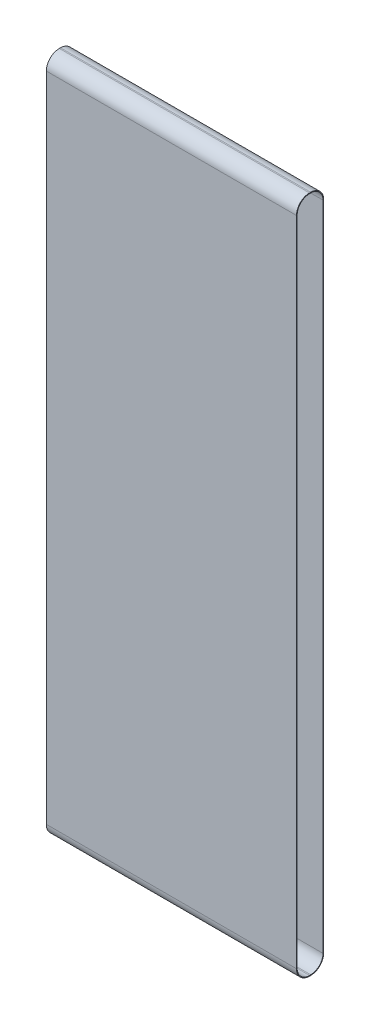
ISO-10303-21;
HEADER;
FILE_DESCRIPTION(('STEP AP214'),'2;1');
FILE_NAME('part.step','',(''),(''),'','','');
FILE_SCHEMA(('AUTOMOTIVE_DESIGN { 1 0 10303 214 1 1 1 1 }'));
ENDSEC;
DATA;
#1=APPLICATION_CONTEXT('core data for automotive mechanical design processes');
#2=APPLICATION_PROTOCOL_DEFINITION('international standard','automotive_design',2000,#1);
#3=PRODUCT_CONTEXT('',#1,'mechanical');
#4=PRODUCT('Part','Part','',(#3));
#5=PRODUCT_RELATED_PRODUCT_CATEGORY('part','',(#4));
#6=PRODUCT_DEFINITION_FORMATION('','',#4);
#7=PRODUCT_DEFINITION_CONTEXT('part definition',#1,'design');
#8=PRODUCT_DEFINITION('design','',#6,#7);
#9=PRODUCT_DEFINITION_SHAPE('','',#8);
#10=(LENGTH_UNIT() NAMED_UNIT(*) SI_UNIT(.MILLI.,.METRE.));
#11=(NAMED_UNIT(*) PLANE_ANGLE_UNIT() SI_UNIT($,.RADIAN.));
#12=(NAMED_UNIT(*) SI_UNIT($,.STERADIAN.) SOLID_ANGLE_UNIT());
#13=UNCERTAINTY_MEASURE_WITH_UNIT(LENGTH_MEASURE(1.E-05),#10,'distance_accuracy_value','');
#14=(GEOMETRIC_REPRESENTATION_CONTEXT(3) GLOBAL_UNCERTAINTY_ASSIGNED_CONTEXT((#13)) GLOBAL_UNIT_ASSIGNED_CONTEXT((#10,
#11,#12)) REPRESENTATION_CONTEXT('',''));
#15=CARTESIAN_POINT('',(0.,0.,0.));
#16=DIRECTION('',(0.,0.,1.));
#17=DIRECTION('',(1.,0.,0.));
#18=AXIS2_PLACEMENT_3D('',#15,#16,#17);
#19=CARTESIAN_POINT('',(-241.3,1308.608,26.289));
#20=DIRECTION('',(1.,0.,0.));
#21=DIRECTION('',(0.,0.,-1.));
#22=AXIS2_PLACEMENT_3D('',#19,#20,#21);
#23=PLANE('',#22);
#24=DIRECTION('',(0.,0.,-1.));
#25=VECTOR('',#24,1.);
#26=CARTESIAN_POINT('',(-241.3,1.34619999999997,1.16839999999996));
#27=LINE('',#26,#25);
#28=CARTESIAN_POINT('',(-241.3,1.34619999999995,1.16839999999997));
#29=VERTEX_POINT('',#28);
#30=CARTESIAN_POINT('',(-241.3,1.3462,-1.16840000000003));
#31=VERTEX_POINT('',#30);
#32=EDGE_CURVE('E161',#29,#31,#27,.T.);
#33=ORIENTED_EDGE('',*,*,#32,.T.);
#34=CARTESIAN_POINT('',(-241.3,25.1205999999999,-1.16840000000003));
#35=DIRECTION('',(1.,0.,0.));
#36=DIRECTION('',(0.,0.,-1.));
#37=AXIS2_PLACEMENT_3D('',#34,#35,#36);
#38=CIRCLE('',#37,23.7744);
#39=CARTESIAN_POINT('',(-241.3,25.1205999999999,-24.9428));
#40=VERTEX_POINT('',#39);
#41=EDGE_CURVE('E154',#31,#40,#38,.T.);
#42=ORIENTED_EDGE('',*,*,#41,.T.);
#43=DIRECTION('',(0.,1.,0.));
#44=VECTOR('',#43,1.);
#45=CARTESIAN_POINT('',(-241.3,25.1205999999999,-24.9428));
#46=LINE('',#45,#44);
#47=CARTESIAN_POINT('',(-241.3,1283.4874,-24.9428));
#48=VERTEX_POINT('',#47);
#49=EDGE_CURVE('E164',#40,#48,#46,.T.);
#50=ORIENTED_EDGE('',*,*,#49,.T.);
#51=CARTESIAN_POINT('',(-241.3,1283.4874,-1.16840000000003));
#52=DIRECTION('',(1.,0.,0.));
#53=DIRECTION('',(0.,0.,-1.));
#54=AXIS2_PLACEMENT_3D('',#51,#52,#53);
#55=CIRCLE('',#54,23.7744);
#56=CARTESIAN_POINT('',(-241.3,1307.2618,-1.16840000000003));
#57=VERTEX_POINT('',#56);
#58=EDGE_CURVE('E55',#48,#57,#55,.T.);
#59=ORIENTED_EDGE('',*,*,#58,.T.);
#60=DIRECTION('',(0.,0.,1.));
#61=VECTOR('',#60,1.);
#62=CARTESIAN_POINT('',(-241.3,1307.2618,-1.16840000000003));
#63=LINE('',#62,#61);
#64=CARTESIAN_POINT('',(-241.3,1307.2618,1.16839999999997));
#65=VERTEX_POINT('',#64);
#66=EDGE_CURVE('E182',#57,#65,#63,.T.);
#67=ORIENTED_EDGE('',*,*,#66,.T.);
#68=CARTESIAN_POINT('',(-241.3,1283.4874,1.16839999999997));
#69=DIRECTION('',(1.,0.,0.));
#70=DIRECTION('',(0.,0.,-1.));
#71=AXIS2_PLACEMENT_3D('',#68,#69,#70);
#72=CIRCLE('',#71,23.7744);
#73=CARTESIAN_POINT('',(-241.3,1283.4874,24.9427999999999));
#74=VERTEX_POINT('',#73);
#75=EDGE_CURVE('E186',#65,#74,#72,.T.);
#76=ORIENTED_EDGE('',*,*,#75,.T.);
#77=DIRECTION('',(0.,-1.,0.));
#78=VECTOR('',#77,1.);
#79=CARTESIAN_POINT('',(-241.3,1283.4874,24.9427999999999));
#80=LINE('',#79,#78);
#81=CARTESIAN_POINT('',(-241.3,25.1205999999999,24.9428));
#82=VERTEX_POINT('',#81);
#83=EDGE_CURVE('E190',#74,#82,#80,.T.);
#84=ORIENTED_EDGE('',*,*,#83,.T.);
#85=CARTESIAN_POINT('',(-241.3,25.1205999999999,1.16839999999997));
#86=DIRECTION('',(1.,0.,0.));
#87=DIRECTION('',(0.,0.,-1.));
#88=AXIS2_PLACEMENT_3D('',#85,#86,#87);
#89=CIRCLE('',#88,23.7744);
#90=EDGE_CURVE('E194',#82,#29,#89,.T.);
#91=ORIENTED_EDGE('',*,*,#90,.T.);
#92=EDGE_LOOP('',(#33,#42,#50,#59,#67,#76,#84,#91));
#93=FACE_BOUND('',#92,.T.);
#94=DIRECTION('',(0.,0.,1.));
#95=VECTOR('',#94,1.);
#96=CARTESIAN_POINT('',(-241.3,1308.608,26.289));
#97=LINE('',#96,#95);
#98=CARTESIAN_POINT('',(-241.3,1308.608,-1.16839999999997));
#99=VERTEX_POINT('',#98);
#100=CARTESIAN_POINT('',(-241.3,1308.608,1.16840000000003));
#101=VERTEX_POINT('',#100);
#102=EDGE_CURVE('E244',#99,#101,#97,.T.);
#103=ORIENTED_EDGE('',*,*,#102,.F.);
#104=CARTESIAN_POINT('',(-241.3,1283.4874,-1.16839999999997));
#105=DIRECTION('',(1.,0.,0.));
#106=DIRECTION('',(0.,0.,-1.));
#107=AXIS2_PLACEMENT_3D('',#104,#105,#106);
#108=CIRCLE('',#107,25.1206);
#109=CARTESIAN_POINT('',(-241.3,1283.4874,-26.289));
#110=VERTEX_POINT('',#109);
#111=EDGE_CURVE('E292',#99,#110,#108,.F.);
#112=ORIENTED_EDGE('',*,*,#111,.T.);
#113=DIRECTION('',(0.,-1.,0.));
#114=VECTOR('',#113,1.);
#115=CARTESIAN_POINT('',(-241.3,1308.608,-26.289));
#116=LINE('',#115,#114);
#117=CARTESIAN_POINT('',(-241.3,25.1205999999999,-26.289));
#118=VERTEX_POINT('',#117);
#119=EDGE_CURVE('E253',#110,#118,#116,.T.);
#120=ORIENTED_EDGE('',*,*,#119,.T.);
#121=CARTESIAN_POINT('',(-241.3,25.1205999999999,-1.16839999999997));
#122=DIRECTION('',(1.,0.,0.));
#123=DIRECTION('',(0.,0.,-1.));
#124=AXIS2_PLACEMENT_3D('',#121,#122,#123);
#125=CIRCLE('',#124,25.1206);
#126=CARTESIAN_POINT('',(-241.3,0.,-1.16839999999997));
#127=VERTEX_POINT('',#126);
#128=EDGE_CURVE('E286',#118,#127,#125,.F.);
#129=ORIENTED_EDGE('',*,*,#128,.T.);
#130=DIRECTION('',(0.,0.,1.));
#131=VECTOR('',#130,1.);
#132=CARTESIAN_POINT('',(-241.3,0.,26.289));
#133=LINE('',#132,#131);
#134=CARTESIAN_POINT('',(-241.3,0.,1.16840000000003));
#135=VERTEX_POINT('',#134);
#136=EDGE_CURVE('E226',#127,#135,#133,.T.);
#137=ORIENTED_EDGE('',*,*,#136,.T.);
#138=CARTESIAN_POINT('',(-241.3,25.1205999999999,1.16840000000003));
#139=DIRECTION('',(1.,0.,0.));
#140=DIRECTION('',(0.,0.,-1.));
#141=AXIS2_PLACEMENT_3D('',#138,#139,#140);
#142=CIRCLE('',#141,25.1206);
#143=CARTESIAN_POINT('',(-241.3,25.1205999999999,26.289));
#144=VERTEX_POINT('',#143);
#145=EDGE_CURVE('E283',#135,#144,#142,.F.);
#146=ORIENTED_EDGE('',*,*,#145,.T.);
#147=DIRECTION('',(0.,-1.,0.));
#148=VECTOR('',#147,1.);
#149=CARTESIAN_POINT('',(-241.3,1308.608,26.289));
#150=LINE('',#149,#148);
#151=CARTESIAN_POINT('',(-241.3,1283.4874,26.289));
#152=VERTEX_POINT('',#151);
#153=EDGE_CURVE('E271',#152,#144,#150,.T.);
#154=ORIENTED_EDGE('',*,*,#153,.F.);
#155=CARTESIAN_POINT('',(-241.3,1283.4874,1.16840000000003));
#156=DIRECTION('',(1.,0.,0.));
#157=DIRECTION('',(0.,0.,-1.));
#158=AXIS2_PLACEMENT_3D('',#155,#156,#157);
#159=CIRCLE('',#158,25.1206);
#160=EDGE_CURVE('E289',#152,#101,#159,.F.);
#161=ORIENTED_EDGE('',*,*,#160,.T.);
#162=EDGE_LOOP('',(#103,#112,#120,#129,#137,#146,#154,#161));
#163=FACE_BOUND('',#162,.T.);
#164=ADVANCED_FACE('F39',(#93,#163),#23,.F.);
#165=CARTESIAN_POINT('',(241.3,1308.608,26.289));
#166=DIRECTION('',(0.,0.,-1.));
#167=DIRECTION('',(-1.,0.,0.));
#168=AXIS2_PLACEMENT_3D('',#165,#166,#167);
#169=PLANE('',#168);
#170=DIRECTION('',(0.,-1.,0.));
#171=VECTOR('',#170,1.);
#172=CARTESIAN_POINT('',(241.3,1308.608,26.289));
#173=LINE('',#172,#171);
#174=CARTESIAN_POINT('',(241.3,1283.4874,26.289));
#175=VERTEX_POINT('',#174);
#176=CARTESIAN_POINT('',(241.3,25.1205999999999,26.289));
#177=VERTEX_POINT('',#176);
#178=EDGE_CURVE('E267',#175,#177,#173,.T.);
#179=ORIENTED_EDGE('',*,*,#178,.F.);
#180=DIRECTION('',(1.,0.,0.));
#181=VECTOR('',#180,1.);
#182=CARTESIAN_POINT('',(-241.3,1283.4874,26.289));
#183=LINE('',#182,#181);
#184=EDGE_CURVE('E318',#175,#152,#183,.F.);
#185=ORIENTED_EDGE('',*,*,#184,.T.);
#186=ORIENTED_EDGE('',*,*,#153,.T.);
#187=DIRECTION('',(1.,0.,0.));
#188=VECTOR('',#187,1.);
#189=CARTESIAN_POINT('',(241.3,25.1205999999999,26.289));
#190=LINE('',#189,#188);
#191=EDGE_CURVE('E314',#144,#177,#190,.T.);
#192=ORIENTED_EDGE('',*,*,#191,.T.);
#193=EDGE_LOOP('',(#179,#185,#186,#192));
#194=FACE_BOUND('',#193,.T.);
#195=ADVANCED_FACE('F334',(#194),#169,.F.);
#196=CARTESIAN_POINT('',(241.3,1308.608,26.289));
#197=DIRECTION('',(-1.,0.,0.));
#198=DIRECTION('',(0.,0.,1.));
#199=AXIS2_PLACEMENT_3D('',#196,#197,#198);
#200=PLANE('',#199);
#201=DIRECTION('',(0.,1.,0.));
#202=VECTOR('',#201,1.);
#203=CARTESIAN_POINT('',(241.3,25.1205999999999,-24.9428));
#204=LINE('',#203,#202);
#205=CARTESIAN_POINT('',(241.3,25.1205999999999,-24.9428));
#206=VERTEX_POINT('',#205);
#207=CARTESIAN_POINT('',(241.3,1283.4874,-24.9428));
#208=VERTEX_POINT('',#207);
#209=EDGE_CURVE('E201',#206,#208,#204,.T.);
#210=ORIENTED_EDGE('',*,*,#209,.F.);
#211=CARTESIAN_POINT('',(241.3,25.1205999999999,-1.16840000000003));
#212=DIRECTION('',(1.,0.,0.));
#213=DIRECTION('',(0.,0.,-1.));
#214=AXIS2_PLACEMENT_3D('',#211,#212,#213);
#215=CIRCLE('',#214,23.7744);
#216=CARTESIAN_POINT('',(241.3,1.3462,-1.16840000000003));
#217=VERTEX_POINT('',#216);
#218=EDGE_CURVE('E63',#217,#206,#215,.T.);
#219=ORIENTED_EDGE('',*,*,#218,.F.);
#220=DIRECTION('',(0.,0.,-1.));
#221=VECTOR('',#220,1.);
#222=CARTESIAN_POINT('',(241.3,1.34619999999997,1.16839999999996));
#223=LINE('',#222,#221);
#224=CARTESIAN_POINT('',(241.3,1.34619999999995,1.16839999999997));
#225=VERTEX_POINT('',#224);
#226=EDGE_CURVE('E173',#225,#217,#223,.T.);
#227=ORIENTED_EDGE('',*,*,#226,.F.);
#228=CARTESIAN_POINT('',(241.3,25.1205999999999,1.16839999999997));
#229=DIRECTION('',(1.,0.,0.));
#230=DIRECTION('',(0.,0.,-1.));
#231=AXIS2_PLACEMENT_3D('',#228,#229,#230);
#232=CIRCLE('',#231,23.7744);
#233=CARTESIAN_POINT('',(241.3,25.1205999999999,24.9428));
#234=VERTEX_POINT('',#233);
#235=EDGE_CURVE('E177',#234,#225,#232,.T.);
#236=ORIENTED_EDGE('',*,*,#235,.F.);
#237=DIRECTION('',(0.,-1.,0.));
#238=VECTOR('',#237,1.);
#239=CARTESIAN_POINT('',(241.3,1283.4874,24.9427999999999));
#240=LINE('',#239,#238);
#241=CARTESIAN_POINT('',(241.3,1283.4874,24.9427999999999));
#242=VERTEX_POINT('',#241);
#243=EDGE_CURVE('E216',#242,#234,#240,.T.);
#244=ORIENTED_EDGE('',*,*,#243,.F.);
#245=CARTESIAN_POINT('',(241.3,1283.4874,1.16839999999997));
#246=DIRECTION('',(1.,0.,0.));
#247=DIRECTION('',(0.,0.,-1.));
#248=AXIS2_PLACEMENT_3D('',#245,#246,#247);
#249=CIRCLE('',#248,23.7744);
#250=CARTESIAN_POINT('',(241.3,1307.2618,1.16839999999997));
#251=VERTEX_POINT('',#250);
#252=EDGE_CURVE('E212',#251,#242,#249,.T.);
#253=ORIENTED_EDGE('',*,*,#252,.F.);
#254=DIRECTION('',(0.,0.,1.));
#255=VECTOR('',#254,1.);
#256=CARTESIAN_POINT('',(241.3,1307.2618,-1.16840000000003));
#257=LINE('',#256,#255);
#258=CARTESIAN_POINT('',(241.3,1307.2618,-1.16840000000003));
#259=VERTEX_POINT('',#258);
#260=EDGE_CURVE('E208',#259,#251,#257,.T.);
#261=ORIENTED_EDGE('',*,*,#260,.F.);
#262=CARTESIAN_POINT('',(241.3,1283.4874,-1.16840000000003));
#263=DIRECTION('',(1.,0.,0.));
#264=DIRECTION('',(0.,0.,-1.));
#265=AXIS2_PLACEMENT_3D('',#262,#263,#264);
#266=CIRCLE('',#265,23.7744);
#267=EDGE_CURVE('E204',#208,#259,#266,.T.);
#268=ORIENTED_EDGE('',*,*,#267,.F.);
#269=EDGE_LOOP('',(#210,#219,#227,#236,#244,#253,#261,#268));
#270=FACE_BOUND('',#269,.T.);
#271=DIRECTION('',(0.,-1.,0.));
#272=VECTOR('',#271,1.);
#273=CARTESIAN_POINT('',(241.3,1308.608,-26.289));
#274=LINE('',#273,#272);
#275=CARTESIAN_POINT('',(241.3,1283.4874,-26.289));
#276=VERTEX_POINT('',#275);
#277=CARTESIAN_POINT('',(241.3,25.1205999999999,-26.289));
#278=VERTEX_POINT('',#277);
#279=EDGE_CURVE('E263',#276,#278,#274,.T.);
#280=ORIENTED_EDGE('',*,*,#279,.F.);
#281=CARTESIAN_POINT('',(241.3,1283.4874,-1.16840000000003));
#282=DIRECTION('',(-1.,0.,0.));
#283=DIRECTION('',(0.,0.,1.));
#284=AXIS2_PLACEMENT_3D('',#281,#282,#283);
#285=CIRCLE('',#284,25.1206);
#286=CARTESIAN_POINT('',(241.3,1308.608,-1.16840000000003));
#287=VERTEX_POINT('',#286);
#288=EDGE_CURVE('E311',#276,#287,#285,.F.);
#289=ORIENTED_EDGE('',*,*,#288,.T.);
#290=DIRECTION('',(0.,0.,-1.));
#291=VECTOR('',#290,1.);
#292=CARTESIAN_POINT('',(241.3,1308.608,26.289));
#293=LINE('',#292,#291);
#294=CARTESIAN_POINT('',(241.3,1308.608,1.16839999999997));
#295=VERTEX_POINT('',#294);
#296=EDGE_CURVE('E248',#295,#287,#293,.T.);
#297=ORIENTED_EDGE('',*,*,#296,.F.);
#298=CARTESIAN_POINT('',(241.3,1283.4874,1.16839999999997));
#299=DIRECTION('',(-1.,0.,0.));
#300=DIRECTION('',(0.,0.,1.));
#301=AXIS2_PLACEMENT_3D('',#298,#299,#300);
#302=CIRCLE('',#301,25.1206);
#303=EDGE_CURVE('E308',#295,#175,#302,.F.);
#304=ORIENTED_EDGE('',*,*,#303,.T.);
#305=ORIENTED_EDGE('',*,*,#178,.T.);
#306=CARTESIAN_POINT('',(241.3,25.1205999999999,1.16839999999997));
#307=DIRECTION('',(-1.,0.,0.));
#308=DIRECTION('',(0.,0.,1.));
#309=AXIS2_PLACEMENT_3D('',#306,#307,#308);
#310=CIRCLE('',#309,25.1206);
#311=CARTESIAN_POINT('',(241.3,0.,1.16839999999997));
#312=VERTEX_POINT('',#311);
#313=EDGE_CURVE('E302',#177,#312,#310,.F.);
#314=ORIENTED_EDGE('',*,*,#313,.T.);
#315=DIRECTION('',(0.,0.,-1.));
#316=VECTOR('',#315,1.);
#317=CARTESIAN_POINT('',(241.3,0.,26.289));
#318=LINE('',#317,#316);
#319=CARTESIAN_POINT('',(241.3,0.,-1.16840000000003));
#320=VERTEX_POINT('',#319);
#321=EDGE_CURVE('E249',#312,#320,#318,.T.);
#322=ORIENTED_EDGE('',*,*,#321,.T.);
#323=CARTESIAN_POINT('',(241.3,25.1205999999999,-1.16840000000003));
#324=DIRECTION('',(-1.,0.,0.));
#325=DIRECTION('',(0.,0.,1.));
#326=AXIS2_PLACEMENT_3D('',#323,#324,#325);
#327=CIRCLE('',#326,25.1206);
#328=EDGE_CURVE('E305',#320,#278,#327,.F.);
#329=ORIENTED_EDGE('',*,*,#328,.T.);
#330=EDGE_LOOP('',(#280,#289,#297,#304,#305,#314,#322,#329));
#331=FACE_BOUND('',#330,.T.);
#332=ADVANCED_FACE('F338',(#270,#331),#200,.F.);
#333=CARTESIAN_POINT('',(241.3,1308.608,-26.289));
#334=DIRECTION('',(0.,0.,1.));
#335=DIRECTION('',(1.,0.,0.));
#336=AXIS2_PLACEMENT_3D('',#333,#334,#335);
#337=PLANE('',#336);
#338=ORIENTED_EDGE('',*,*,#119,.F.);
#339=DIRECTION('',(-1.,0.,0.));
#340=VECTOR('',#339,1.);
#341=CARTESIAN_POINT('',(241.3,1283.4874,-26.289));
#342=LINE('',#341,#340);
#343=EDGE_CURVE('E299',#110,#276,#342,.F.);
#344=ORIENTED_EDGE('',*,*,#343,.T.);
#345=ORIENTED_EDGE('',*,*,#279,.T.);
#346=DIRECTION('',(-1.,0.,0.));
#347=VECTOR('',#346,1.);
#348=CARTESIAN_POINT('',(241.3,25.1205999999999,-26.289));
#349=LINE('',#348,#347);
#350=EDGE_CURVE('E295',#278,#118,#349,.T.);
#351=ORIENTED_EDGE('',*,*,#350,.T.);
#352=EDGE_LOOP('',(#338,#344,#345,#351));
#353=FACE_BOUND('',#352,.T.);
#354=ADVANCED_FACE('F351',(#353),#337,.F.);
#355=CARTESIAN_POINT('',(0.,1308.608,0.));
#356=DIRECTION('',(0.,1.,0.));
#357=DIRECTION('',(0.,0.,1.));
#358=AXIS2_PLACEMENT_3D('',#355,#356,#357);
#359=PLANE('',#358);
#360=ORIENTED_EDGE('',*,*,#296,.T.);
#361=DIRECTION('',(-1.,0.,0.));
#362=VECTOR('',#361,1.);
#363=CARTESIAN_POINT('',(-241.3,1308.608,-1.16839999999997));
#364=LINE('',#363,#362);
#365=EDGE_CURVE('E279',#287,#99,#364,.T.);
#366=ORIENTED_EDGE('',*,*,#365,.T.);
#367=ORIENTED_EDGE('',*,*,#102,.T.);
#368=DIRECTION('',(1.,0.,0.));
#369=VECTOR('',#368,1.);
#370=CARTESIAN_POINT('',(241.3,1308.608,1.16839999999997));
#371=LINE('',#370,#369);
#372=EDGE_CURVE('E275',#101,#295,#371,.T.);
#373=ORIENTED_EDGE('',*,*,#372,.T.);
#374=EDGE_LOOP('',(#360,#366,#367,#373));
#375=FACE_BOUND('',#374,.T.);
#376=ADVANCED_FACE('F345',(#375),#359,.T.);
#377=CARTESIAN_POINT('',(0.,0.,0.));
#378=DIRECTION('',(0.,1.,0.));
#379=DIRECTION('',(0.,0.,1.));
#380=AXIS2_PLACEMENT_3D('',#377,#378,#379);
#381=PLANE('',#380);
#382=ORIENTED_EDGE('',*,*,#136,.F.);
#383=DIRECTION('',(-1.,0.,0.));
#384=VECTOR('',#383,1.);
#385=CARTESIAN_POINT('',(0.,0.,-1.1684));
#386=LINE('',#385,#384);
#387=EDGE_CURVE('E11',#127,#320,#386,.F.);
#388=ORIENTED_EDGE('',*,*,#387,.T.);
#389=ORIENTED_EDGE('',*,*,#321,.F.);
#390=DIRECTION('',(1.,0.,0.));
#391=VECTOR('',#390,1.);
#392=CARTESIAN_POINT('',(0.,0.,1.1684));
#393=LINE('',#392,#391);
#394=EDGE_CURVE('E48',#312,#135,#393,.F.);
#395=ORIENTED_EDGE('',*,*,#394,.T.);
#396=EDGE_LOOP('',(#382,#388,#389,#395));
#397=FACE_BOUND('',#396,.T.);
#398=ADVANCED_FACE('F325',(#397),#381,.F.);
#399=CARTESIAN_POINT('',(0.,1283.4874,-1.1684));
#400=DIRECTION('',(1.,0.,0.));
#401=DIRECTION('',(0.,0.,-1.));
#402=AXIS2_PLACEMENT_3D('',#399,#400,#401);
#403=CYLINDRICAL_SURFACE('',#402,25.1206);
#404=ORIENTED_EDGE('',*,*,#288,.F.);
#405=ORIENTED_EDGE('',*,*,#343,.F.);
#406=ORIENTED_EDGE('',*,*,#111,.F.);
#407=ORIENTED_EDGE('',*,*,#365,.F.);
#408=EDGE_LOOP('',(#404,#405,#406,#407));
#409=FACE_BOUND('',#408,.T.);
#410=ADVANCED_FACE('F354',(#409),#403,.T.);
#411=CARTESIAN_POINT('',(0.,1283.4874,1.1684));
#412=DIRECTION('',(-1.,0.,0.));
#413=DIRECTION('',(0.,0.,1.));
#414=AXIS2_PLACEMENT_3D('',#411,#412,#413);
#415=CYLINDRICAL_SURFACE('',#414,25.1206);
#416=ORIENTED_EDGE('',*,*,#160,.F.);
#417=ORIENTED_EDGE('',*,*,#184,.F.);
#418=ORIENTED_EDGE('',*,*,#303,.F.);
#419=ORIENTED_EDGE('',*,*,#372,.F.);
#420=EDGE_LOOP('',(#416,#417,#418,#419));
#421=FACE_BOUND('',#420,.T.);
#422=ADVANCED_FACE('F343',(#421),#415,.T.);
#423=CARTESIAN_POINT('',(241.3,25.1205999999999,-1.16840000000003));
#424=DIRECTION('',(-1.,0.,0.));
#425=DIRECTION('',(0.,0.,1.));
#426=AXIS2_PLACEMENT_3D('',#423,#424,#425);
#427=CYLINDRICAL_SURFACE('',#426,25.1206);
#428=ORIENTED_EDGE('',*,*,#328,.F.);
#429=ORIENTED_EDGE('',*,*,#387,.F.);
#430=ORIENTED_EDGE('',*,*,#128,.F.);
#431=ORIENTED_EDGE('',*,*,#350,.F.);
#432=EDGE_LOOP('',(#428,#429,#430,#431));
#433=FACE_BOUND('',#432,.T.);
#434=ADVANCED_FACE('F357',(#433),#427,.T.);
#435=CARTESIAN_POINT('',(241.3,25.1205999999999,1.16839999999997));
#436=DIRECTION('',(1.,0.,0.));
#437=DIRECTION('',(0.,0.,-1.));
#438=AXIS2_PLACEMENT_3D('',#435,#436,#437);
#439=CYLINDRICAL_SURFACE('',#438,25.1206);
#440=ORIENTED_EDGE('',*,*,#145,.F.);
#441=ORIENTED_EDGE('',*,*,#394,.F.);
#442=ORIENTED_EDGE('',*,*,#313,.F.);
#443=ORIENTED_EDGE('',*,*,#191,.F.);
#444=EDGE_LOOP('',(#440,#441,#442,#443));
#445=FACE_BOUND('',#444,.T.);
#446=ADVANCED_FACE('F41',(#445),#439,.T.);
#447=CARTESIAN_POINT('',(-241.3,25.1205999999999,-1.16840000000003));
#448=DIRECTION('',(1.,0.,0.));
#449=DIRECTION('',(0.,0.,-1.));
#450=AXIS2_PLACEMENT_3D('',#447,#448,#449);
#451=CYLINDRICAL_SURFACE('',#450,23.7744);
#452=ORIENTED_EDGE('',*,*,#218,.T.);
#453=DIRECTION('',(1.,0.,0.));
#454=VECTOR('',#453,1.);
#455=CARTESIAN_POINT('',(-241.3,25.1205999999999,-24.9428));
#456=LINE('',#455,#454);
#457=EDGE_CURVE('E150',#40,#206,#456,.T.);
#458=ORIENTED_EDGE('',*,*,#457,.F.);
#459=ORIENTED_EDGE('',*,*,#41,.F.);
#460=DIRECTION('',(1.,0.,0.));
#461=VECTOR('',#460,1.);
#462=CARTESIAN_POINT('',(-241.3,1.3462,-1.16840000000003));
#463=LINE('',#462,#461);
#464=EDGE_CURVE('E223',#31,#217,#463,.T.);
#465=ORIENTED_EDGE('',*,*,#464,.T.);
#466=EDGE_LOOP('',(#452,#458,#459,#465));
#467=FACE_BOUND('',#466,.T.);
#468=ADVANCED_FACE('F152',(#467),#451,.F.);
#469=CARTESIAN_POINT('',(-241.3,1.34619999999997,1.16839999999996));
#470=DIRECTION('',(0.,-1.,0.));
#471=DIRECTION('',(0.,0.,-1.));
#472=AXIS2_PLACEMENT_3D('',#469,#470,#471);
#473=PLANE('',#472);
#474=ORIENTED_EDGE('',*,*,#226,.T.);
#475=ORIENTED_EDGE('',*,*,#464,.F.);
#476=ORIENTED_EDGE('',*,*,#32,.F.);
#477=DIRECTION('',(1.,0.,0.));
#478=VECTOR('',#477,1.);
#479=CARTESIAN_POINT('',(-241.3,1.34619999999995,1.16839999999997));
#480=LINE('',#479,#478);
#481=EDGE_CURVE('E227',#29,#225,#480,.T.);
#482=ORIENTED_EDGE('',*,*,#481,.T.);
#483=EDGE_LOOP('',(#474,#475,#476,#482));
#484=FACE_BOUND('',#483,.T.);
#485=ADVANCED_FACE('F408',(#484),#473,.F.);
#486=CARTESIAN_POINT('',(-241.3,25.1205999999999,1.16839999999997));
#487=DIRECTION('',(1.,0.,0.));
#488=DIRECTION('',(0.,0.,-1.));
#489=AXIS2_PLACEMENT_3D('',#486,#487,#488);
#490=CYLINDRICAL_SURFACE('',#489,23.7744);
#491=ORIENTED_EDGE('',*,*,#235,.T.);
#492=ORIENTED_EDGE('',*,*,#481,.F.);
#493=ORIENTED_EDGE('',*,*,#90,.F.);
#494=DIRECTION('',(1.,0.,0.));
#495=VECTOR('',#494,1.);
#496=CARTESIAN_POINT('',(-241.3,25.1205999999999,24.9428));
#497=LINE('',#496,#495);
#498=EDGE_CURVE('E230',#82,#234,#497,.T.);
#499=ORIENTED_EDGE('',*,*,#498,.T.);
#500=EDGE_LOOP('',(#491,#492,#493,#499));
#501=FACE_BOUND('',#500,.T.);
#502=ADVANCED_FACE('F406',(#501),#490,.F.);
#503=CARTESIAN_POINT('',(-241.3,1283.4874,24.9427999999999));
#504=DIRECTION('',(0.,0.,1.));
#505=DIRECTION('',(0.,-1.,0.));
#506=AXIS2_PLACEMENT_3D('',#503,#504,#505);
#507=PLANE('',#506);
#508=ORIENTED_EDGE('',*,*,#243,.T.);
#509=ORIENTED_EDGE('',*,*,#498,.F.);
#510=ORIENTED_EDGE('',*,*,#83,.F.);
#511=DIRECTION('',(1.,0.,0.));
#512=VECTOR('',#511,1.);
#513=CARTESIAN_POINT('',(-241.3,1283.4874,24.9427999999999));
#514=LINE('',#513,#512);
#515=EDGE_CURVE('E233',#74,#242,#514,.T.);
#516=ORIENTED_EDGE('',*,*,#515,.T.);
#517=EDGE_LOOP('',(#508,#509,#510,#516));
#518=FACE_BOUND('',#517,.T.);
#519=ADVANCED_FACE('F402',(#518),#507,.F.);
#520=CARTESIAN_POINT('',(-241.3,1283.4874,1.16839999999997));
#521=DIRECTION('',(1.,0.,0.));
#522=DIRECTION('',(0.,0.,-1.));
#523=AXIS2_PLACEMENT_3D('',#520,#521,#522);
#524=CYLINDRICAL_SURFACE('',#523,23.7744);
#525=ORIENTED_EDGE('',*,*,#252,.T.);
#526=ORIENTED_EDGE('',*,*,#515,.F.);
#527=ORIENTED_EDGE('',*,*,#75,.F.);
#528=DIRECTION('',(1.,0.,0.));
#529=VECTOR('',#528,1.);
#530=CARTESIAN_POINT('',(-241.3,1307.2618,1.16839999999997));
#531=LINE('',#530,#529);
#532=EDGE_CURVE('E236',#65,#251,#531,.T.);
#533=ORIENTED_EDGE('',*,*,#532,.T.);
#534=EDGE_LOOP('',(#525,#526,#527,#533));
#535=FACE_BOUND('',#534,.T.);
#536=ADVANCED_FACE('F399',(#535),#524,.F.);
#537=CARTESIAN_POINT('',(-241.3,1307.2618,-1.16840000000003));
#538=DIRECTION('',(0.,1.,0.));
#539=DIRECTION('',(0.,0.,1.));
#540=AXIS2_PLACEMENT_3D('',#537,#538,#539);
#541=PLANE('',#540);
#542=ORIENTED_EDGE('',*,*,#260,.T.);
#543=ORIENTED_EDGE('',*,*,#532,.F.);
#544=ORIENTED_EDGE('',*,*,#66,.F.);
#545=DIRECTION('',(1.,0.,0.));
#546=VECTOR('',#545,1.);
#547=CARTESIAN_POINT('',(-241.3,1307.2618,-1.16840000000003));
#548=LINE('',#547,#546);
#549=EDGE_CURVE('E239',#57,#259,#548,.T.);
#550=ORIENTED_EDGE('',*,*,#549,.T.);
#551=EDGE_LOOP('',(#542,#543,#544,#550));
#552=FACE_BOUND('',#551,.T.);
#553=ADVANCED_FACE('F395',(#552),#541,.F.);
#554=CARTESIAN_POINT('',(-241.3,1283.4874,-1.16840000000003));
#555=DIRECTION('',(1.,0.,0.));
#556=DIRECTION('',(0.,0.,-1.));
#557=AXIS2_PLACEMENT_3D('',#554,#555,#556);
#558=CYLINDRICAL_SURFACE('',#557,23.7744);
#559=ORIENTED_EDGE('',*,*,#267,.T.);
#560=ORIENTED_EDGE('',*,*,#549,.F.);
#561=ORIENTED_EDGE('',*,*,#58,.F.);
#562=DIRECTION('',(1.,0.,0.));
#563=VECTOR('',#562,1.);
#564=CARTESIAN_POINT('',(-241.3,1283.4874,-24.9428));
#565=LINE('',#564,#563);
#566=EDGE_CURVE('E160',#48,#208,#565,.T.);
#567=ORIENTED_EDGE('',*,*,#566,.T.);
#568=EDGE_LOOP('',(#559,#560,#561,#567));
#569=FACE_BOUND('',#568,.T.);
#570=ADVANCED_FACE('F392',(#569),#558,.F.);
#571=CARTESIAN_POINT('',(-241.3,25.1205999999999,-24.9428));
#572=DIRECTION('',(0.,0.,-1.));
#573=DIRECTION('',(-1.,0.,0.));
#574=AXIS2_PLACEMENT_3D('',#571,#572,#573);
#575=PLANE('',#574);
#576=ORIENTED_EDGE('',*,*,#209,.T.);
#577=ORIENTED_EDGE('',*,*,#566,.F.);
#578=ORIENTED_EDGE('',*,*,#49,.F.);
#579=ORIENTED_EDGE('',*,*,#457,.T.);
#580=EDGE_LOOP('',(#576,#577,#578,#579));
#581=FACE_BOUND('',#580,.T.);
#582=ADVANCED_FACE('F165',(#581),#575,.F.);
#583=CLOSED_SHELL('',(#164,#195,#332,#354,#376,#398,#410,#422,#434,#446,#468,#485,#502,#519,
#536,#553,#570,#582));
#584=MANIFOLD_SOLID_BREP('B2',#583);
#585=ADVANCED_BREP_SHAPE_REPRESENTATION('',(#18,#584),#14);
#586=SHAPE_DEFINITION_REPRESENTATION(#9,#585);
ENDSEC;
END-ISO-10303-21;
